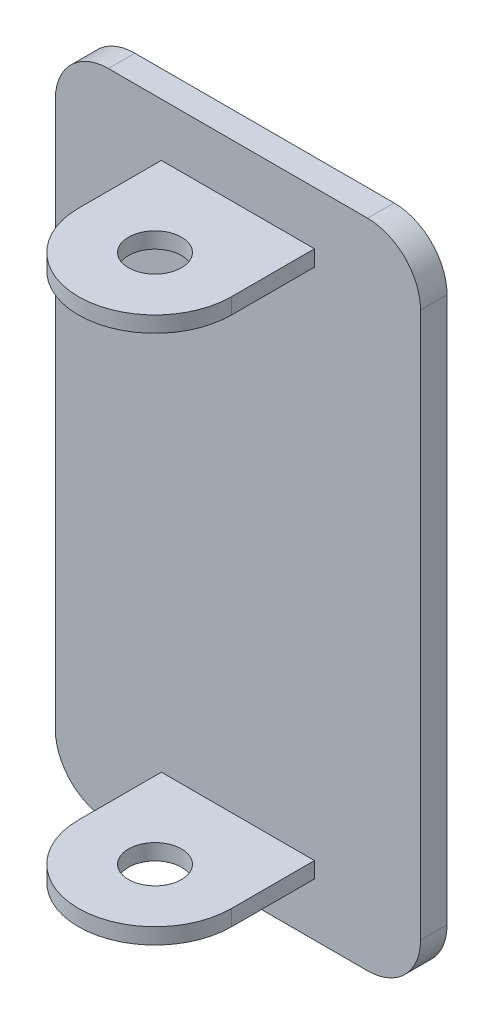
ISO-10303-21;
HEADER;
FILE_DESCRIPTION(('STEP AP214'),'2;1');
FILE_NAME('part.step','',(''),(''),'','','');
FILE_SCHEMA(('AUTOMOTIVE_DESIGN { 1 0 10303 214 1 1 1 1 }'));
ENDSEC;
DATA;
#1=APPLICATION_CONTEXT('core data for automotive mechanical design processes');
#2=APPLICATION_PROTOCOL_DEFINITION('international standard','automotive_design',2000,#1);
#3=PRODUCT_CONTEXT('',#1,'mechanical');
#4=PRODUCT('Part','Part','',(#3));
#5=PRODUCT_RELATED_PRODUCT_CATEGORY('part','',(#4));
#6=PRODUCT_DEFINITION_FORMATION('','',#4);
#7=PRODUCT_DEFINITION_CONTEXT('part definition',#1,'design');
#8=PRODUCT_DEFINITION('design','',#6,#7);
#9=PRODUCT_DEFINITION_SHAPE('','',#8);
#10=(LENGTH_UNIT() NAMED_UNIT(*) SI_UNIT(.MILLI.,.METRE.));
#11=(NAMED_UNIT(*) PLANE_ANGLE_UNIT() SI_UNIT($,.RADIAN.));
#12=(NAMED_UNIT(*) SI_UNIT($,.STERADIAN.) SOLID_ANGLE_UNIT());
#13=UNCERTAINTY_MEASURE_WITH_UNIT(LENGTH_MEASURE(1.E-05),#10,'distance_accuracy_value','');
#14=(GEOMETRIC_REPRESENTATION_CONTEXT(3) GLOBAL_UNCERTAINTY_ASSIGNED_CONTEXT((#13)) GLOBAL_UNIT_ASSIGNED_CONTEXT((#10,
#11,#12)) REPRESENTATION_CONTEXT('',''));
#15=CARTESIAN_POINT('',(0.,0.,0.));
#16=DIRECTION('',(0.,0.,1.));
#17=DIRECTION('',(1.,0.,0.));
#18=AXIS2_PLACEMENT_3D('',#15,#16,#17);
#19=CARTESIAN_POINT('',(10.0000000000002,0.,84.3647006528201));
#20=DIRECTION('',(0.,0.,-1.));
#21=DIRECTION('',(-1.,0.,0.));
#22=AXIS2_PLACEMENT_3D('',#19,#20,#21);
#23=PLANE('',#22);
#24=CARTESIAN_POINT('',(10.0000000000002,0.,84.3647006528201));
#25=DIRECTION('',(0.,0.,-1.));
#26=DIRECTION('',(-1.,0.,0.));
#27=AXIS2_PLACEMENT_3D('',#24,#25,#26);
#28=CIRCLE('',#27,10.);
#29=CARTESIAN_POINT('',(20.0000000000002,0.,84.3647006528201));
#30=VERTEX_POINT('',#29);
#31=CARTESIAN_POINT('',(10.0000000000002,-10.,84.3647006528201));
#32=VERTEX_POINT('',#31);
#33=EDGE_CURVE('E184',#30,#32,#28,.T.);
#34=ORIENTED_EDGE('',*,*,#33,.F.);
#35=DIRECTION('',(0.,-1.,0.));
#36=VECTOR('',#35,1.);
#37=CARTESIAN_POINT('',(20.0000000000002,102.9,84.3647006528201));
#38=LINE('',#37,#36);
#39=CARTESIAN_POINT('',(20.0000000000002,102.9,84.3647006528201));
#40=VERTEX_POINT('',#39);
#41=EDGE_CURVE('E191',#40,#30,#38,.T.);
#42=ORIENTED_EDGE('',*,*,#41,.F.);
#43=CARTESIAN_POINT('',(10.0000000000002,102.9,84.3647006528201));
#44=DIRECTION('',(0.,0.,-1.));
#45=DIRECTION('',(-1.,0.,0.));
#46=AXIS2_PLACEMENT_3D('',#43,#44,#45);
#47=CIRCLE('',#46,10.);
#48=CARTESIAN_POINT('',(10.0000000000002,112.9,84.3647006528201));
#49=VERTEX_POINT('',#48);
#50=EDGE_CURVE('E218',#49,#40,#47,.T.);
#51=ORIENTED_EDGE('',*,*,#50,.F.);
#52=DIRECTION('',(1.,0.,0.));
#53=VECTOR('',#52,1.);
#54=CARTESIAN_POINT('',(10.0000000000002,112.9,84.3647006528201));
#55=LINE('',#54,#53);
#56=CARTESIAN_POINT('',(-38.8675134594811,112.9,84.3647006528201));
#57=VERTEX_POINT('',#56);
#58=EDGE_CURVE('E216',#57,#49,#55,.T.);
#59=ORIENTED_EDGE('',*,*,#58,.F.);
#60=CARTESIAN_POINT('',(-38.8675134594811,102.9,84.3647006528201));
#61=DIRECTION('',(0.,0.,-1.));
#62=DIRECTION('',(1.,0.,0.));
#63=AXIS2_PLACEMENT_3D('',#60,#61,#62);
#64=CIRCLE('',#63,10.);
#65=CARTESIAN_POINT('',(-48.8675134594811,102.9,84.3647006528201));
#66=VERTEX_POINT('',#65);
#67=EDGE_CURVE('E214',#66,#57,#64,.T.);
#68=ORIENTED_EDGE('',*,*,#67,.F.);
#69=DIRECTION('',(0.,1.,0.));
#70=VECTOR('',#69,1.);
#71=CARTESIAN_POINT('',(-48.8675134594811,102.9,84.3647006528201));
#72=LINE('',#71,#70);
#73=CARTESIAN_POINT('',(-48.8675134594811,0.,84.3647006528201));
#74=VERTEX_POINT('',#73);
#75=EDGE_CURVE('E212',#74,#66,#72,.T.);
#76=ORIENTED_EDGE('',*,*,#75,.F.);
#77=CARTESIAN_POINT('',(-38.8675134594811,0.,84.3647006528201));
#78=DIRECTION('',(0.,0.,-1.));
#79=DIRECTION('',(-1.,0.,0.));
#80=AXIS2_PLACEMENT_3D('',#77,#78,#79);
#81=CIRCLE('',#80,10.);
#82=CARTESIAN_POINT('',(-38.8675134594811,-10.,84.3647006528201));
#83=VERTEX_POINT('',#82);
#84=EDGE_CURVE('E210',#83,#74,#81,.T.);
#85=ORIENTED_EDGE('',*,*,#84,.F.);
#86=DIRECTION('',(-1.,0.,0.));
#87=VECTOR('',#86,1.);
#88=CARTESIAN_POINT('',(10.0000000000002,-10.,84.3647006528201));
#89=LINE('',#88,#87);
#90=EDGE_CURVE('E208',#32,#83,#89,.T.);
#91=ORIENTED_EDGE('',*,*,#90,.F.);
#92=EDGE_LOOP('',(#34,#42,#51,#59,#68,#76,#85,#91));
#93=FACE_BOUND('',#92,.T.);
#94=DIRECTION('',(-1.,0.,0.));
#95=VECTOR('',#94,1.);
#96=CARTESIAN_POINT('',(-28.867513459481,102.9,84.3647006528201));
#97=LINE('',#96,#95);
#98=CARTESIAN_POINT('',(2.32452945780892E-13,102.9,84.3647006528201));
#99=VERTEX_POINT('',#98);
#100=CARTESIAN_POINT('',(-28.867513459481,102.9,84.3647006528201));
#101=VERTEX_POINT('',#100);
#102=EDGE_CURVE('E255',#99,#101,#97,.T.);
#103=ORIENTED_EDGE('',*,*,#102,.F.);
#104=DIRECTION('',(0.,-1.,0.));
#105=VECTOR('',#104,1.);
#106=CARTESIAN_POINT('',(2.32452945780892E-13,102.9,84.3647006528201));
#107=LINE('',#106,#105);
#108=CARTESIAN_POINT('',(2.32452945780892E-13,99.9,84.3647006528201));
#109=VERTEX_POINT('',#108);
#110=EDGE_CURVE('E268',#99,#109,#107,.T.);
#111=ORIENTED_EDGE('',*,*,#110,.T.);
#112=DIRECTION('',(1.,0.,0.));
#113=VECTOR('',#112,1.);
#114=CARTESIAN_POINT('',(-28.867513459481,99.9,84.3647006528201));
#115=LINE('',#114,#113);
#116=CARTESIAN_POINT('',(-28.867513459481,99.9,84.3647006528201));
#117=VERTEX_POINT('',#116);
#118=EDGE_CURVE('E252',#117,#109,#115,.T.);
#119=ORIENTED_EDGE('',*,*,#118,.F.);
#120=DIRECTION('',(0.,-1.,0.));
#121=VECTOR('',#120,1.);
#122=CARTESIAN_POINT('',(-28.867513459481,102.9,84.3647006528201));
#123=LINE('',#122,#121);
#124=EDGE_CURVE('E270',#101,#117,#123,.T.);
#125=ORIENTED_EDGE('',*,*,#124,.F.);
#126=EDGE_LOOP('',(#103,#111,#119,#125));
#127=FACE_BOUND('',#126,.T.);
#128=DIRECTION('',(-1.,0.,0.));
#129=VECTOR('',#128,1.);
#130=CARTESIAN_POINT('',(-28.867513459481,0.,84.3647006528201));
#131=LINE('',#130,#129);
#132=CARTESIAN_POINT('',(2.32452945780892E-13,0.,84.3647006528201));
#133=VERTEX_POINT('',#132);
#134=CARTESIAN_POINT('',(-28.867513459481,0.,84.3647006528201));
#135=VERTEX_POINT('',#134);
#136=EDGE_CURVE('E297',#133,#135,#131,.T.);
#137=ORIENTED_EDGE('',*,*,#136,.T.);
#138=DIRECTION('',(0.,-1.,0.));
#139=VECTOR('',#138,1.);
#140=CARTESIAN_POINT('',(-28.867513459481,102.9,84.3647006528201));
#141=LINE('',#140,#139);
#142=CARTESIAN_POINT('',(-28.867513459481,3.,84.3647006528201));
#143=VERTEX_POINT('',#142);
#144=EDGE_CURVE('E176',#143,#135,#141,.T.);
#145=ORIENTED_EDGE('',*,*,#144,.F.);
#146=DIRECTION('',(-1.,0.,0.));
#147=VECTOR('',#146,1.);
#148=CARTESIAN_POINT('',(-28.867513459481,3.,84.3647006528201));
#149=LINE('',#148,#147);
#150=CARTESIAN_POINT('',(2.4459601011273E-13,3.,84.3647006528201));
#151=VERTEX_POINT('',#150);
#152=EDGE_CURVE('E163',#151,#143,#149,.T.);
#153=ORIENTED_EDGE('',*,*,#152,.F.);
#154=DIRECTION('',(0.,-1.,0.));
#155=VECTOR('',#154,1.);
#156=CARTESIAN_POINT('',(2.32452945780892E-13,102.9,84.3647006528201));
#157=LINE('',#156,#155);
#158=EDGE_CURVE('E56',#151,#133,#157,.T.);
#159=ORIENTED_EDGE('',*,*,#158,.T.);
#160=EDGE_LOOP('',(#137,#145,#153,#159));
#161=FACE_BOUND('',#160,.T.);
#162=ADVANCED_FACE('F39',(#93,#127,#161),#23,.F.);
#163=CARTESIAN_POINT('',(2.32452945780892E-13,102.9,84.3647006528201));
#164=DIRECTION('',(-1.,0.,0.));
#165=DIRECTION('',(0.,0.,1.));
#166=AXIS2_PLACEMENT_3D('',#163,#164,#165);
#167=PLANE('',#166);
#168=DIRECTION('',(0.,0.,-1.));
#169=VECTOR('',#168,1.);
#170=CARTESIAN_POINT('',(2.32452945780892E-13,99.9,217.));
#171=LINE('',#170,#169);
#172=CARTESIAN_POINT('',(3.81639164714898E-13,99.9,99.9999999999999));
#173=VERTEX_POINT('',#172);
#174=EDGE_CURVE('E244',#173,#109,#171,.T.);
#175=ORIENTED_EDGE('',*,*,#174,.T.);
#176=ORIENTED_EDGE('',*,*,#110,.F.);
#177=DIRECTION('',(0.,0.,-1.));
#178=VECTOR('',#177,1.);
#179=CARTESIAN_POINT('',(2.32452945780892E-13,102.9,84.3647006528201));
#180=LINE('',#179,#178);
#181=CARTESIAN_POINT('',(3.81639164714898E-13,102.9,99.9999999999999));
#182=VERTEX_POINT('',#181);
#183=EDGE_CURVE('E248',#182,#99,#180,.T.);
#184=ORIENTED_EDGE('',*,*,#183,.F.);
#185=DIRECTION('',(0.,-1.,0.));
#186=VECTOR('',#185,1.);
#187=CARTESIAN_POINT('',(3.81639164714898E-13,102.9,99.9999999999999));
#188=LINE('',#187,#186);
#189=EDGE_CURVE('E43',#182,#173,#188,.T.);
#190=ORIENTED_EDGE('',*,*,#189,.T.);
#191=EDGE_LOOP('',(#175,#176,#184,#190));
#192=FACE_BOUND('',#191,.T.);
#193=ADVANCED_FACE('F286',(#192),#167,.F.);
#194=CARTESIAN_POINT('',(-28.867513459481,102.9,84.3647006528201));
#195=DIRECTION('',(1.,0.,0.));
#196=DIRECTION('',(0.,0.,-1.));
#197=AXIS2_PLACEMENT_3D('',#194,#195,#196);
#198=PLANE('',#197);
#199=DIRECTION('',(0.,0.,-1.));
#200=VECTOR('',#199,1.);
#201=CARTESIAN_POINT('',(-28.867513459481,99.9,217.));
#202=LINE('',#201,#200);
#203=CARTESIAN_POINT('',(-28.867513459481,99.9,99.9999999999999));
#204=VERTEX_POINT('',#203);
#205=EDGE_CURVE('E11',#204,#117,#202,.T.);
#206=ORIENTED_EDGE('',*,*,#205,.F.);
#207=DIRECTION('',(0.,-1.,0.));
#208=VECTOR('',#207,1.);
#209=CARTESIAN_POINT('',(-28.867513459481,102.9,100.));
#210=LINE('',#209,#208);
#211=CARTESIAN_POINT('',(-28.867513459481,102.9,100.));
#212=VERTEX_POINT('',#211);
#213=EDGE_CURVE('E262',#212,#204,#210,.T.);
#214=ORIENTED_EDGE('',*,*,#213,.F.);
#215=DIRECTION('',(0.,0.,1.));
#216=VECTOR('',#215,1.);
#217=CARTESIAN_POINT('',(-28.867513459481,102.9,84.3647006528201));
#218=LINE('',#217,#216);
#219=EDGE_CURVE('E253',#101,#212,#218,.T.);
#220=ORIENTED_EDGE('',*,*,#219,.F.);
#221=ORIENTED_EDGE('',*,*,#124,.T.);
#222=EDGE_LOOP('',(#206,#214,#220,#221));
#223=FACE_BOUND('',#222,.T.);
#224=ADVANCED_FACE('F281',(#223),#198,.F.);
#225=CARTESIAN_POINT('',(-14.4337567297403,102.9,99.9999999999999));
#226=DIRECTION('',(0.,-1.,0.));
#227=DIRECTION('',(0.,0.,-1.));
#228=AXIS2_PLACEMENT_3D('',#225,#226,#227);
#229=CYLINDRICAL_SURFACE('',#228,14.4337567297407);
#230=CARTESIAN_POINT('',(-14.4337567297403,99.9,99.9999999999999));
#231=DIRECTION('',(0.,-1.,0.));
#232=DIRECTION('',(0.,0.,-1.));
#233=AXIS2_PLACEMENT_3D('',#230,#231,#232);
#234=CIRCLE('',#233,14.4337567297407);
#235=EDGE_CURVE('E48',#173,#204,#234,.T.);
#236=ORIENTED_EDGE('',*,*,#235,.F.);
#237=ORIENTED_EDGE('',*,*,#189,.F.);
#238=CARTESIAN_POINT('',(-14.4337567297403,102.9,99.9999999999999));
#239=DIRECTION('',(0.,1.,0.));
#240=DIRECTION('',(0.,0.,1.));
#241=AXIS2_PLACEMENT_3D('',#238,#239,#240);
#242=CIRCLE('',#241,14.4337567297407);
#243=EDGE_CURVE('E250',#212,#182,#242,.T.);
#244=ORIENTED_EDGE('',*,*,#243,.F.);
#245=ORIENTED_EDGE('',*,*,#213,.T.);
#246=EDGE_LOOP('',(#236,#237,#244,#245));
#247=FACE_BOUND('',#246,.T.);
#248=ADVANCED_FACE('F276',(#247),#229,.T.);
#249=CARTESIAN_POINT('',(-14.4337567297403,102.9,99.9999999999999));
#250=DIRECTION('',(0.,-1.,0.));
#251=DIRECTION('',(0.,0.,-1.));
#252=AXIS2_PLACEMENT_3D('',#249,#250,#251);
#253=CYLINDRICAL_SURFACE('',#252,5.00000000000001);
#254=CARTESIAN_POINT('',(-14.4337567297403,102.9,99.9999999999999));
#255=DIRECTION('',(0.,1.,0.));
#256=DIRECTION('',(0.,0.,1.));
#257=AXIS2_PLACEMENT_3D('',#254,#255,#256);
#258=CIRCLE('',#257,5.00000000000001);
#259=CARTESIAN_POINT('',(-14.4337567297403,102.9,105.));
#260=VERTEX_POINT('',#259);
#261=EDGE_CURVE('E249',#260,#260,#258,.T.);
#262=ORIENTED_EDGE('',*,*,#261,.T.);
#263=EDGE_LOOP('',(#262));
#264=FACE_BOUND('',#263,.T.);
#265=CARTESIAN_POINT('',(-14.4337567297403,99.9,99.9999999999999));
#266=DIRECTION('',(0.,-1.,0.));
#267=DIRECTION('',(0.,0.,-1.));
#268=AXIS2_PLACEMENT_3D('',#265,#266,#267);
#269=CIRCLE('',#268,5.00000000000001);
#270=CARTESIAN_POINT('',(-14.4337567297403,99.9,94.9999999999999));
#271=VERTEX_POINT('',#270);
#272=EDGE_CURVE('E245',#271,#271,#269,.T.);
#273=ORIENTED_EDGE('',*,*,#272,.T.);
#274=EDGE_LOOP('',(#273));
#275=FACE_BOUND('',#274,.T.);
#276=ADVANCED_FACE('F41',(#264,#275),#253,.F.);
#277=CARTESIAN_POINT('',(-14.4337567297403,102.9,99.9999999999999));
#278=DIRECTION('',(0.,1.,0.));
#279=DIRECTION('',(0.,0.,1.));
#280=AXIS2_PLACEMENT_3D('',#277,#278,#279);
#281=PLANE('',#280);
#282=ORIENTED_EDGE('',*,*,#183,.T.);
#283=ORIENTED_EDGE('',*,*,#102,.T.);
#284=ORIENTED_EDGE('',*,*,#219,.T.);
#285=ORIENTED_EDGE('',*,*,#243,.T.);
#286=EDGE_LOOP('',(#282,#283,#284,#285));
#287=FACE_BOUND('',#286,.T.);
#288=ORIENTED_EDGE('',*,*,#261,.F.);
#289=EDGE_LOOP('',(#288));
#290=FACE_BOUND('',#289,.T.);
#291=ADVANCED_FACE('F289',(#287,#290),#281,.T.);
#292=CARTESIAN_POINT('',(2.32452945780892E-13,99.9,217.));
#293=DIRECTION('',(0.,-1.,0.));
#294=DIRECTION('',(0.,0.,-1.));
#295=AXIS2_PLACEMENT_3D('',#292,#293,#294);
#296=PLANE('',#295);
#297=ORIENTED_EDGE('',*,*,#272,.F.);
#298=EDGE_LOOP('',(#297));
#299=FACE_BOUND('',#298,.T.);
#300=ORIENTED_EDGE('',*,*,#118,.T.);
#301=ORIENTED_EDGE('',*,*,#174,.F.);
#302=ORIENTED_EDGE('',*,*,#235,.T.);
#303=ORIENTED_EDGE('',*,*,#205,.T.);
#304=EDGE_LOOP('',(#300,#301,#302,#303));
#305=FACE_BOUND('',#304,.T.);
#306=ADVANCED_FACE('F282',(#299,#305),#296,.T.);
#307=CARTESIAN_POINT('',(10.0000000000002,0.,79.3647006528201));
#308=DIRECTION('',(0.,0.,1.));
#309=DIRECTION('',(1.,0.,0.));
#310=AXIS2_PLACEMENT_3D('',#307,#308,#309);
#311=CYLINDRICAL_SURFACE('',#310,10.);
#312=ORIENTED_EDGE('',*,*,#33,.T.);
#313=DIRECTION('',(0.,0.,1.));
#314=VECTOR('',#313,1.);
#315=CARTESIAN_POINT('',(10.0000000000002,-10.,79.3647006528201));
#316=LINE('',#315,#314);
#317=CARTESIAN_POINT('',(10.0000000000002,-10.,79.3647006528201));
#318=VERTEX_POINT('',#317);
#319=EDGE_CURVE('E241',#318,#32,#316,.T.);
#320=ORIENTED_EDGE('',*,*,#319,.F.);
#321=CARTESIAN_POINT('',(10.0000000000002,0.,79.3647006528201));
#322=DIRECTION('',(0.,0.,-1.));
#323=DIRECTION('',(-1.,0.,0.));
#324=AXIS2_PLACEMENT_3D('',#321,#322,#323);
#325=CIRCLE('',#324,10.);
#326=CARTESIAN_POINT('',(20.0000000000002,0.,79.3647006528201));
#327=VERTEX_POINT('',#326);
#328=EDGE_CURVE('E187',#327,#318,#325,.T.);
#329=ORIENTED_EDGE('',*,*,#328,.F.);
#330=DIRECTION('',(0.,0.,1.));
#331=VECTOR('',#330,1.);
#332=CARTESIAN_POINT('',(20.0000000000002,0.,79.3647006528201));
#333=LINE('',#332,#331);
#334=EDGE_CURVE('E205',#327,#30,#333,.T.);
#335=ORIENTED_EDGE('',*,*,#334,.T.);
#336=EDGE_LOOP('',(#312,#320,#329,#335));
#337=FACE_BOUND('',#336,.T.);
#338=ADVANCED_FACE('F365',(#337),#311,.T.);
#339=CARTESIAN_POINT('',(10.0000000000002,-10.,79.3647006528201));
#340=DIRECTION('',(0.,1.,0.));
#341=DIRECTION('',(-1.,0.,0.));
#342=AXIS2_PLACEMENT_3D('',#339,#340,#341);
#343=PLANE('',#342);
#344=ORIENTED_EDGE('',*,*,#90,.T.);
#345=DIRECTION('',(0.,0.,1.));
#346=VECTOR('',#345,1.);
#347=CARTESIAN_POINT('',(-38.8675134594811,-10.,79.3647006528201));
#348=LINE('',#347,#346);
#349=CARTESIAN_POINT('',(-38.8675134594811,-10.,79.3647006528201));
#350=VERTEX_POINT('',#349);
#351=EDGE_CURVE('E238',#350,#83,#348,.T.);
#352=ORIENTED_EDGE('',*,*,#351,.F.);
#353=DIRECTION('',(-1.,0.,0.));
#354=VECTOR('',#353,1.);
#355=CARTESIAN_POINT('',(10.0000000000002,-10.,79.3647006528201));
#356=LINE('',#355,#354);
#357=EDGE_CURVE('E190',#318,#350,#356,.T.);
#358=ORIENTED_EDGE('',*,*,#357,.F.);
#359=ORIENTED_EDGE('',*,*,#319,.T.);
#360=EDGE_LOOP('',(#344,#352,#358,#359));
#361=FACE_BOUND('',#360,.T.);
#362=ADVANCED_FACE('F361',(#361),#343,.F.);
#363=CARTESIAN_POINT('',(-38.8675134594811,0.,79.3647006528201));
#364=DIRECTION('',(0.,0.,1.));
#365=DIRECTION('',(1.,0.,0.));
#366=AXIS2_PLACEMENT_3D('',#363,#364,#365);
#367=CYLINDRICAL_SURFACE('',#366,10.);
#368=ORIENTED_EDGE('',*,*,#84,.T.);
#369=DIRECTION('',(0.,0.,1.));
#370=VECTOR('',#369,1.);
#371=CARTESIAN_POINT('',(-48.8675134594811,0.,79.3647006528201));
#372=LINE('',#371,#370);
#373=CARTESIAN_POINT('',(-48.8675134594811,0.,79.3647006528201));
#374=VERTEX_POINT('',#373);
#375=EDGE_CURVE('E235',#374,#74,#372,.T.);
#376=ORIENTED_EDGE('',*,*,#375,.F.);
#377=CARTESIAN_POINT('',(-38.8675134594811,0.,79.3647006528201));
#378=DIRECTION('',(0.,0.,-1.));
#379=DIRECTION('',(-1.,0.,0.));
#380=AXIS2_PLACEMENT_3D('',#377,#378,#379);
#381=CIRCLE('',#380,10.);
#382=EDGE_CURVE('E193',#350,#374,#381,.T.);
#383=ORIENTED_EDGE('',*,*,#382,.F.);
#384=ORIENTED_EDGE('',*,*,#351,.T.);
#385=EDGE_LOOP('',(#368,#376,#383,#384));
#386=FACE_BOUND('',#385,.T.);
#387=ADVANCED_FACE('F357',(#386),#367,.T.);
#388=CARTESIAN_POINT('',(-48.8675134594811,102.9,79.3647006528201));
#389=DIRECTION('',(1.,0.,0.));
#390=DIRECTION('',(0.,1.,0.));
#391=AXIS2_PLACEMENT_3D('',#388,#389,#390);
#392=PLANE('',#391);
#393=ORIENTED_EDGE('',*,*,#75,.T.);
#394=DIRECTION('',(0.,0.,1.));
#395=VECTOR('',#394,1.);
#396=CARTESIAN_POINT('',(-48.8675134594811,102.9,79.3647006528201));
#397=LINE('',#396,#395);
#398=CARTESIAN_POINT('',(-48.8675134594811,102.9,79.3647006528201));
#399=VERTEX_POINT('',#398);
#400=EDGE_CURVE('E232',#399,#66,#397,.T.);
#401=ORIENTED_EDGE('',*,*,#400,.F.);
#402=DIRECTION('',(0.,1.,0.));
#403=VECTOR('',#402,1.);
#404=CARTESIAN_POINT('',(-48.8675134594811,102.9,79.3647006528201));
#405=LINE('',#404,#403);
#406=EDGE_CURVE('E195',#374,#399,#405,.T.);
#407=ORIENTED_EDGE('',*,*,#406,.F.);
#408=ORIENTED_EDGE('',*,*,#375,.T.);
#409=EDGE_LOOP('',(#393,#401,#407,#408));
#410=FACE_BOUND('',#409,.T.);
#411=ADVANCED_FACE('F353',(#410),#392,.F.);
#412=CARTESIAN_POINT('',(-38.8675134594811,102.9,79.3647006528201));
#413=DIRECTION('',(0.,0.,1.));
#414=DIRECTION('',(1.,0.,0.));
#415=AXIS2_PLACEMENT_3D('',#412,#413,#414);
#416=CYLINDRICAL_SURFACE('',#415,10.);
#417=ORIENTED_EDGE('',*,*,#67,.T.);
#418=DIRECTION('',(0.,0.,1.));
#419=VECTOR('',#418,1.);
#420=CARTESIAN_POINT('',(-38.8675134594811,112.9,79.3647006528201));
#421=LINE('',#420,#419);
#422=CARTESIAN_POINT('',(-38.8675134594811,112.9,79.3647006528201));
#423=VERTEX_POINT('',#422);
#424=EDGE_CURVE('E229',#423,#57,#421,.T.);
#425=ORIENTED_EDGE('',*,*,#424,.F.);
#426=CARTESIAN_POINT('',(-38.8675134594811,102.9,79.3647006528201));
#427=DIRECTION('',(0.,0.,-1.));
#428=DIRECTION('',(1.,0.,0.));
#429=AXIS2_PLACEMENT_3D('',#426,#427,#428);
#430=CIRCLE('',#429,10.);
#431=EDGE_CURVE('E197',#399,#423,#430,.T.);
#432=ORIENTED_EDGE('',*,*,#431,.F.);
#433=ORIENTED_EDGE('',*,*,#400,.T.);
#434=EDGE_LOOP('',(#417,#425,#432,#433));
#435=FACE_BOUND('',#434,.T.);
#436=ADVANCED_FACE('F349',(#435),#416,.T.);
#437=CARTESIAN_POINT('',(10.0000000000002,112.9,79.3647006528201));
#438=DIRECTION('',(0.,-1.,0.));
#439=DIRECTION('',(1.,0.,0.));
#440=AXIS2_PLACEMENT_3D('',#437,#438,#439);
#441=PLANE('',#440);
#442=ORIENTED_EDGE('',*,*,#58,.T.);
#443=DIRECTION('',(0.,0.,1.));
#444=VECTOR('',#443,1.);
#445=CARTESIAN_POINT('',(10.0000000000002,112.9,79.3647006528201));
#446=LINE('',#445,#444);
#447=CARTESIAN_POINT('',(10.0000000000002,112.9,79.3647006528201));
#448=VERTEX_POINT('',#447);
#449=EDGE_CURVE('E226',#448,#49,#446,.T.);
#450=ORIENTED_EDGE('',*,*,#449,.F.);
#451=DIRECTION('',(1.,0.,0.));
#452=VECTOR('',#451,1.);
#453=CARTESIAN_POINT('',(10.0000000000002,112.9,79.3647006528201));
#454=LINE('',#453,#452);
#455=EDGE_CURVE('E199',#423,#448,#454,.T.);
#456=ORIENTED_EDGE('',*,*,#455,.F.);
#457=ORIENTED_EDGE('',*,*,#424,.T.);
#458=EDGE_LOOP('',(#442,#450,#456,#457));
#459=FACE_BOUND('',#458,.T.);
#460=ADVANCED_FACE('F345',(#459),#441,.F.);
#461=CARTESIAN_POINT('',(10.0000000000002,102.9,79.3647006528201));
#462=DIRECTION('',(0.,0.,1.));
#463=DIRECTION('',(1.,0.,0.));
#464=AXIS2_PLACEMENT_3D('',#461,#462,#463);
#465=CYLINDRICAL_SURFACE('',#464,10.);
#466=ORIENTED_EDGE('',*,*,#50,.T.);
#467=DIRECTION('',(0.,0.,1.));
#468=VECTOR('',#467,1.);
#469=CARTESIAN_POINT('',(20.0000000000002,102.9,79.3647006528201));
#470=LINE('',#469,#468);
#471=CARTESIAN_POINT('',(20.0000000000002,102.9,79.3647006528201));
#472=VERTEX_POINT('',#471);
#473=EDGE_CURVE('E223',#472,#40,#470,.T.);
#474=ORIENTED_EDGE('',*,*,#473,.F.);
#475=CARTESIAN_POINT('',(10.0000000000002,102.9,79.3647006528201));
#476=DIRECTION('',(0.,0.,-1.));
#477=DIRECTION('',(-1.,0.,0.));
#478=AXIS2_PLACEMENT_3D('',#475,#476,#477);
#479=CIRCLE('',#478,10.);
#480=EDGE_CURVE('E201',#448,#472,#479,.T.);
#481=ORIENTED_EDGE('',*,*,#480,.F.);
#482=ORIENTED_EDGE('',*,*,#449,.T.);
#483=EDGE_LOOP('',(#466,#474,#481,#482));
#484=FACE_BOUND('',#483,.T.);
#485=ADVANCED_FACE('F341',(#484),#465,.T.);
#486=CARTESIAN_POINT('',(20.0000000000002,102.9,79.3647006528201));
#487=DIRECTION('',(-1.,0.,0.));
#488=DIRECTION('',(0.,-1.,0.));
#489=AXIS2_PLACEMENT_3D('',#486,#487,#488);
#490=PLANE('',#489);
#491=ORIENTED_EDGE('',*,*,#41,.T.);
#492=ORIENTED_EDGE('',*,*,#334,.F.);
#493=DIRECTION('',(0.,-1.,0.));
#494=VECTOR('',#493,1.);
#495=CARTESIAN_POINT('',(20.0000000000002,102.9,79.3647006528201));
#496=LINE('',#495,#494);
#497=EDGE_CURVE('E203',#472,#327,#496,.T.);
#498=ORIENTED_EDGE('',*,*,#497,.F.);
#499=ORIENTED_EDGE('',*,*,#473,.T.);
#500=EDGE_LOOP('',(#491,#492,#498,#499));
#501=FACE_BOUND('',#500,.T.);
#502=ADVANCED_FACE('F336',(#501),#490,.F.);
#503=CARTESIAN_POINT('',(10.0000000000002,0.,79.3647006528201));
#504=DIRECTION('',(0.,0.,-1.));
#505=DIRECTION('',(-1.,0.,0.));
#506=AXIS2_PLACEMENT_3D('',#503,#504,#505);
#507=PLANE('',#506);
#508=ORIENTED_EDGE('',*,*,#328,.T.);
#509=ORIENTED_EDGE('',*,*,#357,.T.);
#510=ORIENTED_EDGE('',*,*,#382,.T.);
#511=ORIENTED_EDGE('',*,*,#406,.T.);
#512=ORIENTED_EDGE('',*,*,#431,.T.);
#513=ORIENTED_EDGE('',*,*,#455,.T.);
#514=ORIENTED_EDGE('',*,*,#480,.T.);
#515=ORIENTED_EDGE('',*,*,#497,.T.);
#516=EDGE_LOOP('',(#508,#509,#510,#511,#512,#513,#514,#515));
#517=FACE_BOUND('',#516,.T.);
#518=ADVANCED_FACE('F330',(#517),#507,.T.);
#519=CARTESIAN_POINT('',(-14.4337567297403,102.9,99.9999999999999));
#520=DIRECTION('',(0.,-1.,0.));
#521=DIRECTION('',(0.,0.,-1.));
#522=AXIS2_PLACEMENT_3D('',#519,#520,#521);
#523=CYLINDRICAL_SURFACE('',#522,14.4337567297407);
#524=CARTESIAN_POINT('',(-14.4337567297403,3.,99.9999999999999));
#525=DIRECTION('',(0.,1.,0.));
#526=DIRECTION('',(0.,0.,1.));
#527=AXIS2_PLACEMENT_3D('',#524,#525,#526);
#528=CIRCLE('',#527,14.4337567297407);
#529=CARTESIAN_POINT('',(-28.867513459481,3.,100.));
#530=VERTEX_POINT('',#529);
#531=CARTESIAN_POINT('',(2.4459601011273E-13,3.,99.9999999999999));
#532=VERTEX_POINT('',#531);
#533=EDGE_CURVE('E154',#530,#532,#528,.T.);
#534=ORIENTED_EDGE('',*,*,#533,.F.);
#535=DIRECTION('',(0.,-1.,0.));
#536=VECTOR('',#535,1.);
#537=CARTESIAN_POINT('',(-28.867513459481,102.9,100.));
#538=LINE('',#537,#536);
#539=CARTESIAN_POINT('',(-28.867513459481,0.,100.));
#540=VERTEX_POINT('',#539);
#541=EDGE_CURVE('E174',#530,#540,#538,.T.);
#542=ORIENTED_EDGE('',*,*,#541,.T.);
#543=CARTESIAN_POINT('',(-14.4337567297403,0.,99.9999999999999));
#544=DIRECTION('',(0.,1.,0.));
#545=DIRECTION('',(0.,0.,1.));
#546=AXIS2_PLACEMENT_3D('',#543,#544,#545);
#547=CIRCLE('',#546,14.4337567297407);
#548=CARTESIAN_POINT('',(3.81639164714898E-13,0.,99.9999999999999));
#549=VERTEX_POINT('',#548);
#550=EDGE_CURVE('E172',#540,#549,#547,.T.);
#551=ORIENTED_EDGE('',*,*,#550,.T.);
#552=DIRECTION('',(0.,-1.,0.));
#553=VECTOR('',#552,1.);
#554=CARTESIAN_POINT('',(3.81639164714898E-13,102.9,99.9999999999999));
#555=LINE('',#554,#553);
#556=EDGE_CURVE('E167',#532,#549,#555,.T.);
#557=ORIENTED_EDGE('',*,*,#556,.F.);
#558=EDGE_LOOP('',(#534,#542,#551,#557));
#559=FACE_BOUND('',#558,.T.);
#560=ADVANCED_FACE('F170',(#559),#523,.T.);
#561=CARTESIAN_POINT('',(-28.867513459481,102.9,84.3647006528201));
#562=DIRECTION('',(1.,0.,0.));
#563=DIRECTION('',(0.,0.,-1.));
#564=AXIS2_PLACEMENT_3D('',#561,#562,#563);
#565=PLANE('',#564);
#566=DIRECTION('',(0.,0.,-1.));
#567=VECTOR('',#566,1.);
#568=CARTESIAN_POINT('',(-28.867513459481,3.,217.));
#569=LINE('',#568,#567);
#570=EDGE_CURVE('E159',#530,#143,#569,.T.);
#571=ORIENTED_EDGE('',*,*,#570,.T.);
#572=ORIENTED_EDGE('',*,*,#144,.T.);
#573=DIRECTION('',(0.,0.,1.));
#574=VECTOR('',#573,1.);
#575=CARTESIAN_POINT('',(-28.867513459481,0.,84.3647006528201));
#576=LINE('',#575,#574);
#577=EDGE_CURVE('E178',#135,#540,#576,.T.);
#578=ORIENTED_EDGE('',*,*,#577,.T.);
#579=ORIENTED_EDGE('',*,*,#541,.F.);
#580=EDGE_LOOP('',(#571,#572,#578,#579));
#581=FACE_BOUND('',#580,.T.);
#582=ADVANCED_FACE('F310',(#581),#565,.F.);
#583=CARTESIAN_POINT('',(2.32452945780892E-13,102.9,84.3647006528201));
#584=DIRECTION('',(-1.,0.,0.));
#585=DIRECTION('',(0.,0.,1.));
#586=AXIS2_PLACEMENT_3D('',#583,#584,#585);
#587=PLANE('',#586);
#588=DIRECTION('',(0.,0.,-1.));
#589=VECTOR('',#588,1.);
#590=CARTESIAN_POINT('',(2.4431977326463E-13,3.,217.));
#591=LINE('',#590,#589);
#592=EDGE_CURVE('E156',#532,#151,#591,.T.);
#593=ORIENTED_EDGE('',*,*,#592,.F.);
#594=ORIENTED_EDGE('',*,*,#556,.T.);
#595=DIRECTION('',(0.,0.,-1.));
#596=VECTOR('',#595,1.);
#597=CARTESIAN_POINT('',(2.32452945780892E-13,0.,84.3647006528201));
#598=LINE('',#597,#596);
#599=EDGE_CURVE('E300',#549,#133,#598,.T.);
#600=ORIENTED_EDGE('',*,*,#599,.T.);
#601=ORIENTED_EDGE('',*,*,#158,.F.);
#602=EDGE_LOOP('',(#593,#594,#600,#601));
#603=FACE_BOUND('',#602,.T.);
#604=ADVANCED_FACE('F166',(#603),#587,.F.);
#605=CARTESIAN_POINT('',(-14.4337567297403,0.,99.9999999999999));
#606=DIRECTION('',(0.,1.,0.));
#607=DIRECTION('',(0.,0.,1.));
#608=AXIS2_PLACEMENT_3D('',#605,#606,#607);
#609=PLANE('',#608);
#610=ORIENTED_EDGE('',*,*,#599,.F.);
#611=ORIENTED_EDGE('',*,*,#550,.F.);
#612=ORIENTED_EDGE('',*,*,#577,.F.);
#613=ORIENTED_EDGE('',*,*,#136,.F.);
#614=EDGE_LOOP('',(#610,#611,#612,#613));
#615=FACE_BOUND('',#614,.T.);
#616=CARTESIAN_POINT('',(-14.4337567297403,0.,99.9999999999999));
#617=DIRECTION('',(0.,1.,0.));
#618=DIRECTION('',(0.,0.,1.));
#619=AXIS2_PLACEMENT_3D('',#616,#617,#618);
#620=CIRCLE('',#619,5.00000000000001);
#621=CARTESIAN_POINT('',(-14.4337567297403,0.,105.));
#622=VERTEX_POINT('',#621);
#623=EDGE_CURVE('E303',#622,#622,#620,.T.);
#624=ORIENTED_EDGE('',*,*,#623,.T.);
#625=EDGE_LOOP('',(#624));
#626=FACE_BOUND('',#625,.T.);
#627=ADVANCED_FACE('F311',(#615,#626),#609,.F.);
#628=CARTESIAN_POINT('',(-14.4337567297403,102.9,99.9999999999999));
#629=DIRECTION('',(0.,-1.,0.));
#630=DIRECTION('',(0.,0.,-1.));
#631=AXIS2_PLACEMENT_3D('',#628,#629,#630);
#632=CYLINDRICAL_SURFACE('',#631,5.00000000000001);
#633=ORIENTED_EDGE('',*,*,#623,.F.);
#634=EDGE_LOOP('',(#633));
#635=FACE_BOUND('',#634,.T.);
#636=CARTESIAN_POINT('',(-14.4337567297403,3.,99.9999999999999));
#637=DIRECTION('',(0.,1.,0.));
#638=DIRECTION('',(0.,0.,1.));
#639=AXIS2_PLACEMENT_3D('',#636,#637,#638);
#640=CIRCLE('',#639,5.00000000000001);
#641=CARTESIAN_POINT('',(-14.4337567297403,3.,105.));
#642=VERTEX_POINT('',#641);
#643=EDGE_CURVE('E164',#642,#642,#640,.T.);
#644=ORIENTED_EDGE('',*,*,#643,.T.);
#645=EDGE_LOOP('',(#644));
#646=FACE_BOUND('',#645,.T.);
#647=ADVANCED_FACE('F314',(#635,#646),#632,.F.);
#648=CARTESIAN_POINT('',(2.4431977326463E-13,3.,217.));
#649=DIRECTION('',(0.,1.,0.));
#650=DIRECTION('',(0.,0.,1.));
#651=AXIS2_PLACEMENT_3D('',#648,#649,#650);
#652=PLANE('',#651);
#653=ORIENTED_EDGE('',*,*,#643,.F.);
#654=EDGE_LOOP('',(#653));
#655=FACE_BOUND('',#654,.T.);
#656=ORIENTED_EDGE('',*,*,#152,.T.);
#657=ORIENTED_EDGE('',*,*,#570,.F.);
#658=ORIENTED_EDGE('',*,*,#533,.T.);
#659=ORIENTED_EDGE('',*,*,#592,.T.);
#660=EDGE_LOOP('',(#656,#657,#658,#659));
#661=FACE_BOUND('',#660,.T.);
#662=ADVANCED_FACE('F155',(#655,#661),#652,.T.);
#663=CLOSED_SHELL('',(#162,#193,#224,#248,#276,#291,#306,#338,#362,#387,#411,#436,#460,#485,
#502,#518,#560,#582,#604,#627,#647,#662));
#664=MANIFOLD_SOLID_BREP('B2',#663);
#665=ADVANCED_BREP_SHAPE_REPRESENTATION('',(#18,#664),#14);
#666=SHAPE_DEFINITION_REPRESENTATION(#9,#665);
ENDSEC;
END-ISO-10303-21;
